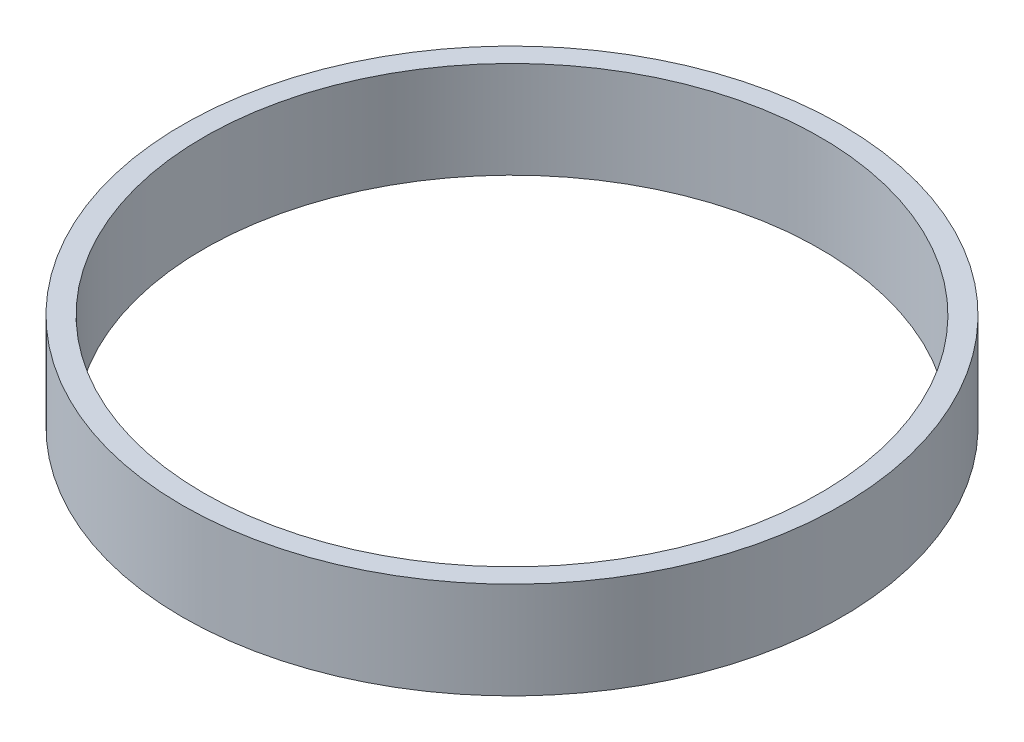
ISO-10303-21;
HEADER;
FILE_DESCRIPTION(('STEP AP214'),'2;1');
FILE_NAME('part.step','',(''),(''),'','','');
FILE_SCHEMA(('AUTOMOTIVE_DESIGN { 1 0 10303 214 1 1 1 1 }'));
ENDSEC;
DATA;
#1=APPLICATION_CONTEXT('core data for automotive mechanical design processes');
#2=APPLICATION_PROTOCOL_DEFINITION('international standard','automotive_design',2000,#1);
#3=PRODUCT_CONTEXT('',#1,'mechanical');
#4=PRODUCT('Part','Part','',(#3));
#5=PRODUCT_RELATED_PRODUCT_CATEGORY('part','',(#4));
#6=PRODUCT_DEFINITION_FORMATION('','',#4);
#7=PRODUCT_DEFINITION_CONTEXT('part definition',#1,'design');
#8=PRODUCT_DEFINITION('design','',#6,#7);
#9=PRODUCT_DEFINITION_SHAPE('','',#8);
#10=(LENGTH_UNIT() NAMED_UNIT(*) SI_UNIT(.MILLI.,.METRE.));
#11=(NAMED_UNIT(*) PLANE_ANGLE_UNIT() SI_UNIT($,.RADIAN.));
#12=(NAMED_UNIT(*) SI_UNIT($,.STERADIAN.) SOLID_ANGLE_UNIT());
#13=UNCERTAINTY_MEASURE_WITH_UNIT(LENGTH_MEASURE(1.E-05),#10,'distance_accuracy_value','');
#14=(GEOMETRIC_REPRESENTATION_CONTEXT(3) GLOBAL_UNCERTAINTY_ASSIGNED_CONTEXT((#13)) GLOBAL_UNIT_ASSIGNED_CONTEXT((#10,
#11,#12)) REPRESENTATION_CONTEXT('',''));
#15=CARTESIAN_POINT('',(0.,0.,0.));
#16=DIRECTION('',(0.,0.,1.));
#17=DIRECTION('',(1.,0.,0.));
#18=AXIS2_PLACEMENT_3D('',#15,#16,#17);
#19=CARTESIAN_POINT('',(0.,10.,0.));
#20=DIRECTION('',(0.,1.,0.));
#21=DIRECTION('',(0.,0.,1.));
#22=AXIS2_PLACEMENT_3D('',#19,#20,#21);
#23=PLANE('',#22);
#24=CARTESIAN_POINT('',(0.,10.,0.));
#25=DIRECTION('',(0.,1.,0.));
#26=DIRECTION('',(0.,0.,1.));
#27=AXIS2_PLACEMENT_3D('',#24,#25,#26);
#28=CIRCLE('',#27,34.05);
#29=CARTESIAN_POINT('',(0.,10.,34.05));
#30=VERTEX_POINT('',#29);
#31=EDGE_CURVE('E10',#30,#30,#28,.T.);
#32=ORIENTED_EDGE('',*,*,#31,.T.);
#33=EDGE_LOOP('',(#32));
#34=FACE_BOUND('',#33,.T.);
#35=CARTESIAN_POINT('',(0.,10.,0.));
#36=DIRECTION('',(0.,1.,0.));
#37=DIRECTION('',(0.,0.,1.));
#38=AXIS2_PLACEMENT_3D('',#35,#36,#37);
#39=CIRCLE('',#38,31.85);
#40=CARTESIAN_POINT('',(0.,10.,31.85));
#41=VERTEX_POINT('',#40);
#42=EDGE_CURVE('E54',#41,#41,#39,.T.);
#43=ORIENTED_EDGE('',*,*,#42,.F.);
#44=EDGE_LOOP('',(#43));
#45=FACE_BOUND('',#44,.T.);
#46=ADVANCED_FACE('F41',(#34,#45),#23,.T.);
#47=CARTESIAN_POINT('',(0.,0.,0.));
#48=DIRECTION('',(0.,1.,0.));
#49=DIRECTION('',(0.,0.,1.));
#50=AXIS2_PLACEMENT_3D('',#47,#48,#49);
#51=PLANE('',#50);
#52=CARTESIAN_POINT('',(0.,0.,0.));
#53=DIRECTION('',(0.,1.,0.));
#54=DIRECTION('',(0.,0.,1.));
#55=AXIS2_PLACEMENT_3D('',#52,#53,#54);
#56=CIRCLE('',#55,34.05);
#57=CARTESIAN_POINT('',(0.,0.,34.05));
#58=VERTEX_POINT('',#57);
#59=EDGE_CURVE('E45',#58,#58,#56,.T.);
#60=ORIENTED_EDGE('',*,*,#59,.F.);
#61=EDGE_LOOP('',(#60));
#62=FACE_BOUND('',#61,.T.);
#63=CARTESIAN_POINT('',(0.,0.,0.));
#64=DIRECTION('',(0.,1.,0.));
#65=DIRECTION('',(0.,0.,1.));
#66=AXIS2_PLACEMENT_3D('',#63,#64,#65);
#67=CIRCLE('',#66,31.85);
#68=CARTESIAN_POINT('',(0.,0.,31.85));
#69=VERTEX_POINT('',#68);
#70=EDGE_CURVE('E56',#69,#69,#67,.T.);
#71=ORIENTED_EDGE('',*,*,#70,.T.);
#72=EDGE_LOOP('',(#71));
#73=FACE_BOUND('',#72,.T.);
#74=ADVANCED_FACE('F68',(#62,#73),#51,.F.);
#75=CARTESIAN_POINT('',(0.,10.,0.));
#76=DIRECTION('',(0.,-1.,0.));
#77=DIRECTION('',(0.,0.,-1.));
#78=AXIS2_PLACEMENT_3D('',#75,#76,#77);
#79=CYLINDRICAL_SURFACE('',#78,34.05);
#80=ORIENTED_EDGE('',*,*,#31,.F.);
#81=EDGE_LOOP('',(#80));
#82=FACE_BOUND('',#81,.T.);
#83=ORIENTED_EDGE('',*,*,#59,.T.);
#84=EDGE_LOOP('',(#83));
#85=FACE_BOUND('',#84,.T.);
#86=ADVANCED_FACE('F43',(#82,#85),#79,.T.);
#87=CARTESIAN_POINT('',(0.,10.,0.));
#88=DIRECTION('',(0.,-1.,0.));
#89=DIRECTION('',(0.,0.,-1.));
#90=AXIS2_PLACEMENT_3D('',#87,#88,#89);
#91=CYLINDRICAL_SURFACE('',#90,31.85);
#92=ORIENTED_EDGE('',*,*,#42,.T.);
#93=EDGE_LOOP('',(#92));
#94=FACE_BOUND('',#93,.T.);
#95=ORIENTED_EDGE('',*,*,#70,.F.);
#96=EDGE_LOOP('',(#95));
#97=FACE_BOUND('',#96,.T.);
#98=ADVANCED_FACE('F64',(#94,#97),#91,.F.);
#99=CLOSED_SHELL('',(#46,#74,#86,#98));
#100=MANIFOLD_SOLID_BREP('B2',#99);
#101=ADVANCED_BREP_SHAPE_REPRESENTATION('',(#18,#100),#14);
#102=SHAPE_DEFINITION_REPRESENTATION(#9,#101);
ENDSEC;
END-ISO-10303-21;
